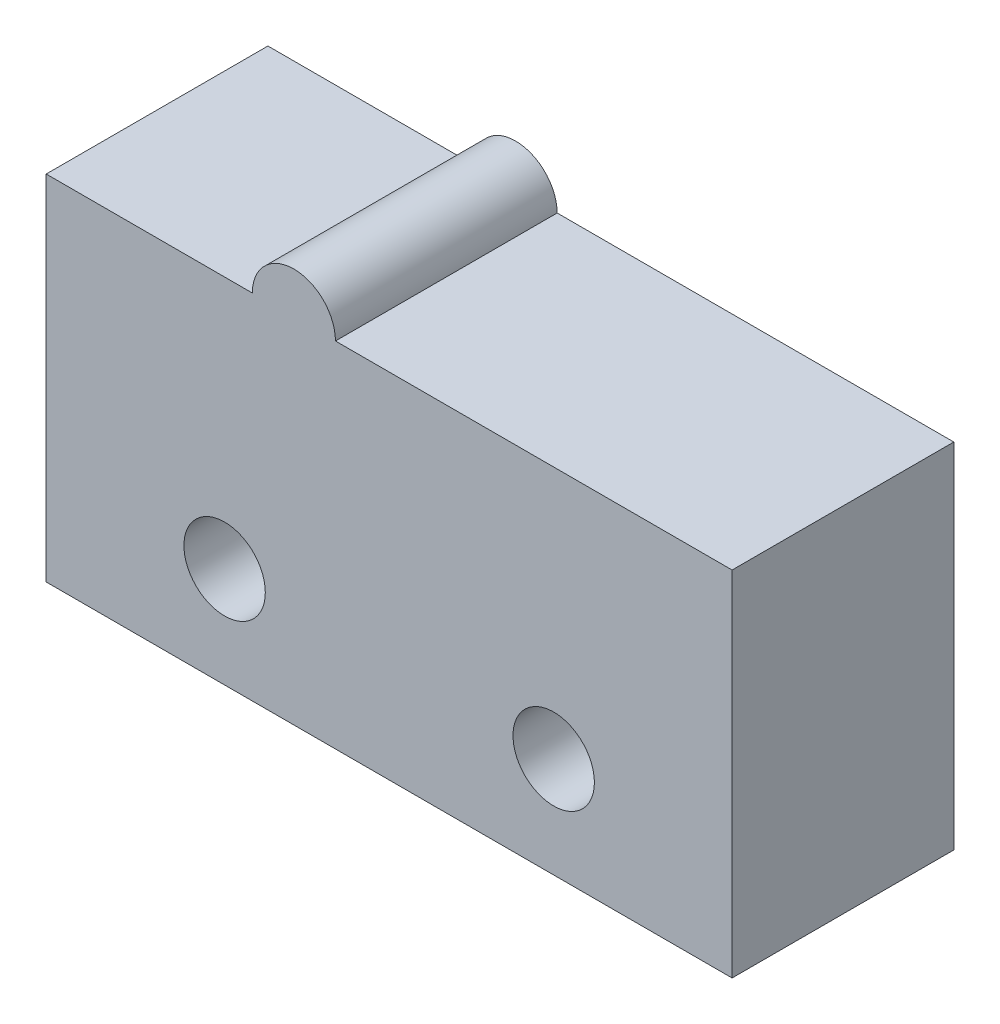
ISO-10303-21;
HEADER;
FILE_DESCRIPTION(('STEP AP214'),'2;1');
FILE_NAME('part.step','',(''),(''),'','','');
FILE_SCHEMA(('AUTOMOTIVE_DESIGN { 1 0 10303 214 1 1 1 1 }'));
ENDSEC;
DATA;
#1=APPLICATION_CONTEXT('core data for automotive mechanical design processes');
#2=APPLICATION_PROTOCOL_DEFINITION('international standard','automotive_design',2000,#1);
#3=PRODUCT_CONTEXT('',#1,'mechanical');
#4=PRODUCT('Part','Part','',(#3));
#5=PRODUCT_RELATED_PRODUCT_CATEGORY('part','',(#4));
#6=PRODUCT_DEFINITION_FORMATION('','',#4);
#7=PRODUCT_DEFINITION_CONTEXT('part definition',#1,'design');
#8=PRODUCT_DEFINITION('design','',#6,#7);
#9=PRODUCT_DEFINITION_SHAPE('','',#8);
#10=(LENGTH_UNIT() NAMED_UNIT(*) SI_UNIT(.MILLI.,.METRE.));
#11=(NAMED_UNIT(*) PLANE_ANGLE_UNIT() SI_UNIT($,.RADIAN.));
#12=(NAMED_UNIT(*) SI_UNIT($,.STERADIAN.) SOLID_ANGLE_UNIT());
#13=UNCERTAINTY_MEASURE_WITH_UNIT(LENGTH_MEASURE(1.E-05),#10,'distance_accuracy_value','');
#14=(GEOMETRIC_REPRESENTATION_CONTEXT(3) GLOBAL_UNCERTAINTY_ASSIGNED_CONTEXT((#13)) GLOBAL_UNIT_ASSIGNED_CONTEXT((#10,
#11,#12)) REPRESENTATION_CONTEXT('',''));
#15=CARTESIAN_POINT('',(0.,0.,0.));
#16=DIRECTION('',(0.,0.,1.));
#17=DIRECTION('',(1.,0.,0.));
#18=AXIS2_PLACEMENT_3D('',#15,#16,#17);
#19=CARTESIAN_POINT('',(7.15,10.2,6.4));
#20=DIRECTION('',(0.,0.,1.));
#21=DIRECTION('',(1.,0.,0.));
#22=AXIS2_PLACEMENT_3D('',#19,#20,#21);
#23=PLANE('',#22);
#24=CARTESIAN_POINT('',(14.65,2.9,6.4));
#25=DIRECTION('',(0.,0.,1.));
#26=DIRECTION('',(1.,0.,0.));
#27=AXIS2_PLACEMENT_3D('',#24,#25,#26);
#28=CIRCLE('',#27,1.175);
#29=CARTESIAN_POINT('',(15.825,2.9,6.4));
#30=VERTEX_POINT('',#29);
#31=EDGE_CURVE('E142',#30,#30,#28,.T.);
#32=ORIENTED_EDGE('',*,*,#31,.F.);
#33=EDGE_LOOP('',(#32));
#34=FACE_BOUND('',#33,.T.);
#35=DIRECTION('',(0.,-1.,0.));
#36=VECTOR('',#35,1.);
#37=CARTESIAN_POINT('',(0.,10.2,6.4));
#38=LINE('',#37,#36);
#39=CARTESIAN_POINT('',(0.,10.2,6.4));
#40=VERTEX_POINT('',#39);
#41=CARTESIAN_POINT('',(0.,0.,6.4));
#42=VERTEX_POINT('',#41);
#43=EDGE_CURVE('E154',#40,#42,#38,.T.);
#44=ORIENTED_EDGE('',*,*,#43,.T.);
#45=DIRECTION('',(1.,0.,0.));
#46=VECTOR('',#45,1.);
#47=CARTESIAN_POINT('',(0.,0.,6.4));
#48=LINE('',#47,#46);
#49=CARTESIAN_POINT('',(19.8,0.,6.4));
#50=VERTEX_POINT('',#49);
#51=EDGE_CURVE('E102',#42,#50,#48,.T.);
#52=ORIENTED_EDGE('',*,*,#51,.T.);
#53=DIRECTION('',(0.,1.,0.));
#54=VECTOR('',#53,1.);
#55=CARTESIAN_POINT('',(19.8,0.,6.4));
#56=LINE('',#55,#54);
#57=CARTESIAN_POINT('',(19.8,10.2,6.4));
#58=VERTEX_POINT('',#57);
#59=EDGE_CURVE('E115',#50,#58,#56,.T.);
#60=ORIENTED_EDGE('',*,*,#59,.T.);
#61=DIRECTION('',(-1.,0.,0.));
#62=VECTOR('',#61,1.);
#63=CARTESIAN_POINT('',(19.8,10.2,6.4));
#64=LINE('',#63,#62);
#65=CARTESIAN_POINT('',(8.35,10.2,6.4));
#66=VERTEX_POINT('',#65);
#67=EDGE_CURVE('E109',#58,#66,#64,.T.);
#68=ORIENTED_EDGE('',*,*,#67,.T.);
#69=CARTESIAN_POINT('',(7.15,10.2,6.4));
#70=DIRECTION('',(0.,0.,1.));
#71=DIRECTION('',(1.,0.,0.));
#72=AXIS2_PLACEMENT_3D('',#69,#70,#71);
#73=CIRCLE('',#72,1.2);
#74=CARTESIAN_POINT('',(5.94999999999999,10.2,6.4));
#75=VERTEX_POINT('',#74);
#76=EDGE_CURVE('E113',#66,#75,#73,.T.);
#77=ORIENTED_EDGE('',*,*,#76,.T.);
#78=DIRECTION('',(-1.,0.,0.));
#79=VECTOR('',#78,1.);
#80=CARTESIAN_POINT('',(5.95,10.2,6.4));
#81=LINE('',#80,#79);
#82=EDGE_CURVE('E65',#75,#40,#81,.T.);
#83=ORIENTED_EDGE('',*,*,#82,.T.);
#84=EDGE_LOOP('',(#44,#52,#60,#68,#77,#83));
#85=FACE_BOUND('',#84,.T.);
#86=CARTESIAN_POINT('',(5.15,2.9,6.4));
#87=DIRECTION('',(0.,0.,1.));
#88=DIRECTION('',(1.,0.,0.));
#89=AXIS2_PLACEMENT_3D('',#86,#87,#88);
#90=CIRCLE('',#89,1.175);
#91=CARTESIAN_POINT('',(6.325,2.9,6.4));
#92=VERTEX_POINT('',#91);
#93=EDGE_CURVE('E200',#92,#92,#90,.T.);
#94=ORIENTED_EDGE('',*,*,#93,.F.);
#95=EDGE_LOOP('',(#94));
#96=FACE_BOUND('',#95,.T.);
#97=ADVANCED_FACE('F47',(#34,#85,#96),#23,.T.);
#98=CARTESIAN_POINT('',(7.15,10.2,0.));
#99=DIRECTION('',(0.,0.,1.));
#100=DIRECTION('',(1.,0.,0.));
#101=AXIS2_PLACEMENT_3D('',#98,#99,#100);
#102=PLANE('',#101);
#103=DIRECTION('',(0.,-1.,0.));
#104=VECTOR('',#103,1.);
#105=CARTESIAN_POINT('',(0.,10.2,0.));
#106=LINE('',#105,#104);
#107=CARTESIAN_POINT('',(0.,10.2,0.));
#108=VERTEX_POINT('',#107);
#109=CARTESIAN_POINT('',(0.,0.,0.));
#110=VERTEX_POINT('',#109);
#111=EDGE_CURVE('E137',#108,#110,#106,.T.);
#112=ORIENTED_EDGE('',*,*,#111,.F.);
#113=DIRECTION('',(-1.,0.,0.));
#114=VECTOR('',#113,1.);
#115=CARTESIAN_POINT('',(5.95,10.2,0.));
#116=LINE('',#115,#114);
#117=CARTESIAN_POINT('',(5.94999999999999,10.2,0.));
#118=VERTEX_POINT('',#117);
#119=EDGE_CURVE('E94',#118,#108,#116,.T.);
#120=ORIENTED_EDGE('',*,*,#119,.F.);
#121=CARTESIAN_POINT('',(7.15,10.2,0.));
#122=DIRECTION('',(0.,0.,1.));
#123=DIRECTION('',(1.,0.,0.));
#124=AXIS2_PLACEMENT_3D('',#121,#122,#123);
#125=CIRCLE('',#124,1.2);
#126=CARTESIAN_POINT('',(8.35,10.2,0.));
#127=VERTEX_POINT('',#126);
#128=EDGE_CURVE('E88',#127,#118,#125,.T.);
#129=ORIENTED_EDGE('',*,*,#128,.F.);
#130=DIRECTION('',(-1.,0.,0.));
#131=VECTOR('',#130,1.);
#132=CARTESIAN_POINT('',(19.8,10.2,0.));
#133=LINE('',#132,#131);
#134=CARTESIAN_POINT('',(19.8,10.2,0.));
#135=VERTEX_POINT('',#134);
#136=EDGE_CURVE('E124',#135,#127,#133,.T.);
#137=ORIENTED_EDGE('',*,*,#136,.F.);
#138=DIRECTION('',(0.,1.,0.));
#139=VECTOR('',#138,1.);
#140=CARTESIAN_POINT('',(19.8,0.,0.));
#141=LINE('',#140,#139);
#142=CARTESIAN_POINT('',(19.8,0.,0.));
#143=VERTEX_POINT('',#142);
#144=EDGE_CURVE('E145',#143,#135,#141,.T.);
#145=ORIENTED_EDGE('',*,*,#144,.F.);
#146=DIRECTION('',(1.,0.,0.));
#147=VECTOR('',#146,1.);
#148=CARTESIAN_POINT('',(0.,0.,0.));
#149=LINE('',#148,#147);
#150=EDGE_CURVE('E141',#110,#143,#149,.T.);
#151=ORIENTED_EDGE('',*,*,#150,.F.);
#152=EDGE_LOOP('',(#112,#120,#129,#137,#145,#151));
#153=FACE_BOUND('',#152,.T.);
#154=CARTESIAN_POINT('',(14.65,2.9,0.));
#155=DIRECTION('',(0.,0.,1.));
#156=DIRECTION('',(1.,0.,0.));
#157=AXIS2_PLACEMENT_3D('',#154,#155,#156);
#158=CIRCLE('',#157,1.175);
#159=CARTESIAN_POINT('',(15.825,2.9,0.));
#160=VERTEX_POINT('',#159);
#161=EDGE_CURVE('E208',#160,#160,#158,.T.);
#162=ORIENTED_EDGE('',*,*,#161,.T.);
#163=EDGE_LOOP('',(#162));
#164=FACE_BOUND('',#163,.T.);
#165=CARTESIAN_POINT('',(5.15,2.9,0.));
#166=DIRECTION('',(0.,0.,1.));
#167=DIRECTION('',(1.,0.,0.));
#168=AXIS2_PLACEMENT_3D('',#165,#166,#167);
#169=CIRCLE('',#168,1.175);
#170=CARTESIAN_POINT('',(6.325,2.9,0.));
#171=VERTEX_POINT('',#170);
#172=EDGE_CURVE('E203',#171,#171,#169,.T.);
#173=ORIENTED_EDGE('',*,*,#172,.T.);
#174=EDGE_LOOP('',(#173));
#175=FACE_BOUND('',#174,.T.);
#176=ADVANCED_FACE('F167',(#153,#164,#175),#102,.F.);
#177=CARTESIAN_POINT('',(0.,10.2,6.4));
#178=DIRECTION('',(1.,0.,0.));
#179=DIRECTION('',(0.,0.,-1.));
#180=AXIS2_PLACEMENT_3D('',#177,#178,#179);
#181=PLANE('',#180);
#182=ORIENTED_EDGE('',*,*,#111,.T.);
#183=DIRECTION('',(0.,0.,-1.));
#184=VECTOR('',#183,1.);
#185=CARTESIAN_POINT('',(0.,0.,6.4));
#186=LINE('',#185,#184);
#187=EDGE_CURVE('E11',#42,#110,#186,.T.);
#188=ORIENTED_EDGE('',*,*,#187,.F.);
#189=ORIENTED_EDGE('',*,*,#43,.F.);
#190=DIRECTION('',(0.,0.,-1.));
#191=VECTOR('',#190,1.);
#192=CARTESIAN_POINT('',(0.,10.2,6.4));
#193=LINE('',#192,#191);
#194=EDGE_CURVE('E133',#40,#108,#193,.T.);
#195=ORIENTED_EDGE('',*,*,#194,.T.);
#196=EDGE_LOOP('',(#182,#188,#189,#195));
#197=FACE_BOUND('',#196,.T.);
#198=ADVANCED_FACE('F49',(#197),#181,.F.);
#199=CARTESIAN_POINT('',(0.,0.,6.4));
#200=DIRECTION('',(0.,1.,0.));
#201=DIRECTION('',(0.,0.,1.));
#202=AXIS2_PLACEMENT_3D('',#199,#200,#201);
#203=PLANE('',#202);
#204=ORIENTED_EDGE('',*,*,#150,.T.);
#205=DIRECTION('',(0.,0.,-1.));
#206=VECTOR('',#205,1.);
#207=CARTESIAN_POINT('',(19.8,0.,6.4));
#208=LINE('',#207,#206);
#209=EDGE_CURVE('E57',#50,#143,#208,.T.);
#210=ORIENTED_EDGE('',*,*,#209,.F.);
#211=ORIENTED_EDGE('',*,*,#51,.F.);
#212=ORIENTED_EDGE('',*,*,#187,.T.);
#213=EDGE_LOOP('',(#204,#210,#211,#212));
#214=FACE_BOUND('',#213,.T.);
#215=ADVANCED_FACE('F256',(#214),#203,.F.);
#216=CARTESIAN_POINT('',(19.8,0.,6.4));
#217=DIRECTION('',(-1.,0.,0.));
#218=DIRECTION('',(0.,0.,1.));
#219=AXIS2_PLACEMENT_3D('',#216,#217,#218);
#220=PLANE('',#219);
#221=ORIENTED_EDGE('',*,*,#144,.T.);
#222=DIRECTION('',(0.,0.,-1.));
#223=VECTOR('',#222,1.);
#224=CARTESIAN_POINT('',(19.8,10.2,6.4));
#225=LINE('',#224,#223);
#226=EDGE_CURVE('E126',#58,#135,#225,.T.);
#227=ORIENTED_EDGE('',*,*,#226,.F.);
#228=ORIENTED_EDGE('',*,*,#59,.F.);
#229=ORIENTED_EDGE('',*,*,#209,.T.);
#230=EDGE_LOOP('',(#221,#227,#228,#229));
#231=FACE_BOUND('',#230,.T.);
#232=ADVANCED_FACE('F164',(#231),#220,.F.);
#233=CARTESIAN_POINT('',(19.8,10.2,6.4));
#234=DIRECTION('',(0.,-1.,0.));
#235=DIRECTION('',(1.,0.,0.));
#236=AXIS2_PLACEMENT_3D('',#233,#234,#235);
#237=PLANE('',#236);
#238=ORIENTED_EDGE('',*,*,#136,.T.);
#239=DIRECTION('',(0.,0.,-1.));
#240=VECTOR('',#239,1.);
#241=CARTESIAN_POINT('',(8.35,10.2,6.4));
#242=LINE('',#241,#240);
#243=EDGE_CURVE('E121',#66,#127,#242,.T.);
#244=ORIENTED_EDGE('',*,*,#243,.F.);
#245=ORIENTED_EDGE('',*,*,#67,.F.);
#246=ORIENTED_EDGE('',*,*,#226,.T.);
#247=EDGE_LOOP('',(#238,#244,#245,#246));
#248=FACE_BOUND('',#247,.T.);
#249=ADVANCED_FACE('F122',(#248),#237,.F.);
#250=CARTESIAN_POINT('',(7.15,10.2,6.4));
#251=DIRECTION('',(0.,0.,-1.));
#252=DIRECTION('',(-1.,0.,0.));
#253=AXIS2_PLACEMENT_3D('',#250,#251,#252);
#254=CYLINDRICAL_SURFACE('',#253,1.2);
#255=ORIENTED_EDGE('',*,*,#128,.T.);
#256=DIRECTION('',(0.,0.,-1.));
#257=VECTOR('',#256,1.);
#258=CARTESIAN_POINT('',(5.94999999999999,10.2,6.4));
#259=LINE('',#258,#257);
#260=EDGE_CURVE('E127',#75,#118,#259,.T.);
#261=ORIENTED_EDGE('',*,*,#260,.F.);
#262=ORIENTED_EDGE('',*,*,#76,.F.);
#263=ORIENTED_EDGE('',*,*,#243,.T.);
#264=EDGE_LOOP('',(#255,#261,#262,#263));
#265=FACE_BOUND('',#264,.T.);
#266=ADVANCED_FACE('F129',(#265),#254,.T.);
#267=CARTESIAN_POINT('',(5.95,10.2,6.4));
#268=DIRECTION('',(0.,-1.,0.));
#269=DIRECTION('',(1.,0.,0.));
#270=AXIS2_PLACEMENT_3D('',#267,#268,#269);
#271=PLANE('',#270);
#272=ORIENTED_EDGE('',*,*,#119,.T.);
#273=ORIENTED_EDGE('',*,*,#194,.F.);
#274=ORIENTED_EDGE('',*,*,#82,.F.);
#275=ORIENTED_EDGE('',*,*,#260,.T.);
#276=EDGE_LOOP('',(#272,#273,#274,#275));
#277=FACE_BOUND('',#276,.T.);
#278=ADVANCED_FACE('F172',(#277),#271,.F.);
#279=CARTESIAN_POINT('',(14.65,2.9,6.4));
#280=DIRECTION('',(0.,0.,-1.));
#281=DIRECTION('',(-1.,0.,0.));
#282=AXIS2_PLACEMENT_3D('',#279,#280,#281);
#283=CYLINDRICAL_SURFACE('',#282,1.175);
#284=ORIENTED_EDGE('',*,*,#31,.T.);
#285=EDGE_LOOP('',(#284));
#286=FACE_BOUND('',#285,.T.);
#287=ORIENTED_EDGE('',*,*,#161,.F.);
#288=EDGE_LOOP('',(#287));
#289=FACE_BOUND('',#288,.T.);
#290=ADVANCED_FACE('F174',(#286,#289),#283,.F.);
#291=CARTESIAN_POINT('',(5.15,2.9,6.4));
#292=DIRECTION('',(0.,0.,-1.));
#293=DIRECTION('',(-1.,0.,0.));
#294=AXIS2_PLACEMENT_3D('',#291,#292,#293);
#295=CYLINDRICAL_SURFACE('',#294,1.175);
#296=ORIENTED_EDGE('',*,*,#93,.T.);
#297=EDGE_LOOP('',(#296));
#298=FACE_BOUND('',#297,.T.);
#299=ORIENTED_EDGE('',*,*,#172,.F.);
#300=EDGE_LOOP('',(#299));
#301=FACE_BOUND('',#300,.T.);
#302=ADVANCED_FACE('F180',(#298,#301),#295,.F.);
#303=CLOSED_SHELL('',(#97,#176,#198,#215,#232,#249,#266,#278,#290,#302));
#304=MANIFOLD_SOLID_BREP('B2',#303);
#305=ADVANCED_BREP_SHAPE_REPRESENTATION('',(#18,#304),#14);
#306=SHAPE_DEFINITION_REPRESENTATION(#9,#305);
ENDSEC;
END-ISO-10303-21;
